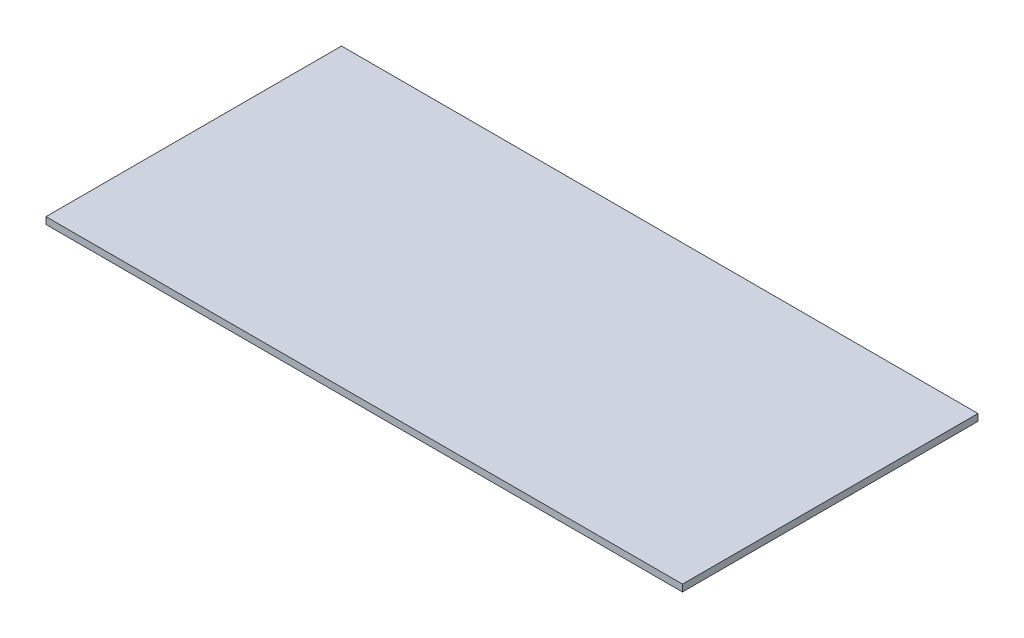
ISO-10303-21;
HEADER;
FILE_DESCRIPTION(('STEP AP214'),'2;1');
FILE_NAME('part.step','',(''),(''),'','','');
FILE_SCHEMA(('AUTOMOTIVE_DESIGN { 1 0 10303 214 1 1 1 1 }'));
ENDSEC;
DATA;
#1=APPLICATION_CONTEXT('core data for automotive mechanical design processes');
#2=APPLICATION_PROTOCOL_DEFINITION('international standard','automotive_design',2000,#1);
#3=PRODUCT_CONTEXT('',#1,'mechanical');
#4=PRODUCT('Part','Part','',(#3));
#5=PRODUCT_RELATED_PRODUCT_CATEGORY('part','',(#4));
#6=PRODUCT_DEFINITION_FORMATION('','',#4);
#7=PRODUCT_DEFINITION_CONTEXT('part definition',#1,'design');
#8=PRODUCT_DEFINITION('design','',#6,#7);
#9=PRODUCT_DEFINITION_SHAPE('','',#8);
#10=(LENGTH_UNIT() NAMED_UNIT(*) SI_UNIT(.MILLI.,.METRE.));
#11=(NAMED_UNIT(*) PLANE_ANGLE_UNIT() SI_UNIT($,.RADIAN.));
#12=(NAMED_UNIT(*) SI_UNIT($,.STERADIAN.) SOLID_ANGLE_UNIT());
#13=UNCERTAINTY_MEASURE_WITH_UNIT(LENGTH_MEASURE(1.E-05),#10,'distance_accuracy_value','');
#14=(GEOMETRIC_REPRESENTATION_CONTEXT(3) GLOBAL_UNCERTAINTY_ASSIGNED_CONTEXT((#13)) GLOBAL_UNIT_ASSIGNED_CONTEXT((#10,
#11,#12)) REPRESENTATION_CONTEXT('',''));
#15=CARTESIAN_POINT('',(0.,0.,0.));
#16=DIRECTION('',(0.,0.,1.));
#17=DIRECTION('',(1.,0.,0.));
#18=AXIS2_PLACEMENT_3D('',#15,#16,#17);
#19=CARTESIAN_POINT('',(0.,3.,-45.5890410958904));
#20=DIRECTION('',(-1.,0.,0.));
#21=DIRECTION('',(0.,0.,1.));
#22=AXIS2_PLACEMENT_3D('',#19,#20,#21);
#23=PLANE('',#22);
#24=DIRECTION('',(0.,0.,-1.));
#25=VECTOR('',#24,1.);
#26=CARTESIAN_POINT('',(0.,0.,-45.5890410958904));
#27=LINE('',#26,#25);
#28=CARTESIAN_POINT('',(0.,0.,84.4109589041096));
#29=VERTEX_POINT('',#28);
#30=CARTESIAN_POINT('',(0.,0.,-45.5890410958904));
#31=VERTEX_POINT('',#30);
#32=EDGE_CURVE('E114',#29,#31,#27,.T.);
#33=ORIENTED_EDGE('',*,*,#32,.T.);
#34=DIRECTION('',(0.,-1.,0.));
#35=VECTOR('',#34,1.);
#36=CARTESIAN_POINT('',(0.,3.,-45.5890410958904));
#37=LINE('',#36,#35);
#38=CARTESIAN_POINT('',(0.,3.,-45.5890410958904));
#39=VERTEX_POINT('',#38);
#40=EDGE_CURVE('E11',#39,#31,#37,.T.);
#41=ORIENTED_EDGE('',*,*,#40,.F.);
#42=DIRECTION('',(0.,0.,-1.));
#43=VECTOR('',#42,1.);
#44=CARTESIAN_POINT('',(0.,3.,-45.5890410958904));
#45=LINE('',#44,#43);
#46=CARTESIAN_POINT('',(0.,3.,84.4109589041096));
#47=VERTEX_POINT('',#46);
#48=EDGE_CURVE('E100',#47,#39,#45,.T.);
#49=ORIENTED_EDGE('',*,*,#48,.F.);
#50=DIRECTION('',(0.,-1.,0.));
#51=VECTOR('',#50,1.);
#52=CARTESIAN_POINT('',(0.,3.,84.4109589041096));
#53=LINE('',#52,#51);
#54=EDGE_CURVE('E108',#47,#29,#53,.T.);
#55=ORIENTED_EDGE('',*,*,#54,.T.);
#56=EDGE_LOOP('',(#33,#41,#49,#55));
#57=FACE_BOUND('',#56,.T.);
#58=ADVANCED_FACE('F44',(#57),#23,.F.);
#59=CARTESIAN_POINT('',(0.,3.,-45.5890410958904));
#60=DIRECTION('',(0.,0.,1.));
#61=DIRECTION('',(1.,0.,0.));
#62=AXIS2_PLACEMENT_3D('',#59,#60,#61);
#63=PLANE('',#62);
#64=DIRECTION('',(-1.,0.,0.));
#65=VECTOR('',#64,1.);
#66=CARTESIAN_POINT('',(0.,0.,-45.5890410958904));
#67=LINE('',#66,#65);
#68=CARTESIAN_POINT('',(-280.,0.,-45.5890410958904));
#69=VERTEX_POINT('',#68);
#70=EDGE_CURVE('E105',#31,#69,#67,.T.);
#71=ORIENTED_EDGE('',*,*,#70,.T.);
#72=DIRECTION('',(0.,-1.,0.));
#73=VECTOR('',#72,1.);
#74=CARTESIAN_POINT('',(-280.,3.,-45.5890410958904));
#75=LINE('',#74,#73);
#76=CARTESIAN_POINT('',(-280.,3.,-45.5890410958904));
#77=VERTEX_POINT('',#76);
#78=EDGE_CURVE('E53',#77,#69,#75,.T.);
#79=ORIENTED_EDGE('',*,*,#78,.F.);
#80=DIRECTION('',(-1.,0.,0.));
#81=VECTOR('',#80,1.);
#82=CARTESIAN_POINT('',(0.,3.,-45.5890410958904));
#83=LINE('',#82,#81);
#84=EDGE_CURVE('E95',#39,#77,#83,.T.);
#85=ORIENTED_EDGE('',*,*,#84,.F.);
#86=ORIENTED_EDGE('',*,*,#40,.T.);
#87=EDGE_LOOP('',(#71,#79,#85,#86));
#88=FACE_BOUND('',#87,.T.);
#89=ADVANCED_FACE('F101',(#88),#63,.F.);
#90=CARTESIAN_POINT('',(-280.,3.,-45.5890410958904));
#91=DIRECTION('',(1.,0.,0.));
#92=DIRECTION('',(0.,0.,-1.));
#93=AXIS2_PLACEMENT_3D('',#90,#91,#92);
#94=PLANE('',#93);
#95=DIRECTION('',(0.,0.,1.));
#96=VECTOR('',#95,1.);
#97=CARTESIAN_POINT('',(-280.,0.,-45.5890410958904));
#98=LINE('',#97,#96);
#99=CARTESIAN_POINT('',(-280.,0.,84.4109589041096));
#100=VERTEX_POINT('',#99);
#101=EDGE_CURVE('E78',#69,#100,#98,.T.);
#102=ORIENTED_EDGE('',*,*,#101,.T.);
#103=DIRECTION('',(0.,-1.,0.));
#104=VECTOR('',#103,1.);
#105=CARTESIAN_POINT('',(-280.,3.,84.4109589041096));
#106=LINE('',#105,#104);
#107=CARTESIAN_POINT('',(-280.,3.,84.4109589041096));
#108=VERTEX_POINT('',#107);
#109=EDGE_CURVE('E102',#108,#100,#106,.T.);
#110=ORIENTED_EDGE('',*,*,#109,.F.);
#111=DIRECTION('',(0.,0.,1.));
#112=VECTOR('',#111,1.);
#113=CARTESIAN_POINT('',(-280.,3.,-45.5890410958904));
#114=LINE('',#113,#112);
#115=EDGE_CURVE('E92',#77,#108,#114,.T.);
#116=ORIENTED_EDGE('',*,*,#115,.F.);
#117=ORIENTED_EDGE('',*,*,#78,.T.);
#118=EDGE_LOOP('',(#102,#110,#116,#117));
#119=FACE_BOUND('',#118,.T.);
#120=ADVANCED_FACE('F104',(#119),#94,.F.);
#121=CARTESIAN_POINT('',(0.,3.,84.4109589041096));
#122=DIRECTION('',(0.,0.,-1.));
#123=DIRECTION('',(-1.,0.,0.));
#124=AXIS2_PLACEMENT_3D('',#121,#122,#123);
#125=PLANE('',#124);
#126=DIRECTION('',(1.,0.,0.));
#127=VECTOR('',#126,1.);
#128=CARTESIAN_POINT('',(0.,0.,84.4109589041096));
#129=LINE('',#128,#127);
#130=EDGE_CURVE('E82',#100,#29,#129,.T.);
#131=ORIENTED_EDGE('',*,*,#130,.T.);
#132=ORIENTED_EDGE('',*,*,#54,.F.);
#133=DIRECTION('',(1.,0.,0.));
#134=VECTOR('',#133,1.);
#135=CARTESIAN_POINT('',(0.,3.,84.4109589041096));
#136=LINE('',#135,#134);
#137=EDGE_CURVE('E65',#108,#47,#136,.T.);
#138=ORIENTED_EDGE('',*,*,#137,.F.);
#139=ORIENTED_EDGE('',*,*,#109,.T.);
#140=EDGE_LOOP('',(#131,#132,#138,#139));
#141=FACE_BOUND('',#140,.T.);
#142=ADVANCED_FACE('F127',(#141),#125,.F.);
#143=CARTESIAN_POINT('',(0.,3.,0.));
#144=DIRECTION('',(0.,-1.,0.));
#145=DIRECTION('',(0.,0.,-1.));
#146=AXIS2_PLACEMENT_3D('',#143,#144,#145);
#147=PLANE('',#146);
#148=ORIENTED_EDGE('',*,*,#48,.T.);
#149=ORIENTED_EDGE('',*,*,#84,.T.);
#150=ORIENTED_EDGE('',*,*,#115,.T.);
#151=ORIENTED_EDGE('',*,*,#137,.T.);
#152=EDGE_LOOP('',(#148,#149,#150,#151));
#153=FACE_BOUND('',#152,.T.);
#154=ADVANCED_FACE('F91',(#153),#147,.F.);
#155=CARTESIAN_POINT('',(0.,0.,0.));
#156=DIRECTION('',(0.,-1.,0.));
#157=DIRECTION('',(0.,0.,-1.));
#158=AXIS2_PLACEMENT_3D('',#155,#156,#157);
#159=PLANE('',#158);
#160=ORIENTED_EDGE('',*,*,#32,.F.);
#161=ORIENTED_EDGE('',*,*,#130,.F.);
#162=ORIENTED_EDGE('',*,*,#101,.F.);
#163=ORIENTED_EDGE('',*,*,#70,.F.);
#164=EDGE_LOOP('',(#160,#161,#162,#163));
#165=FACE_BOUND('',#164,.T.);
#166=ADVANCED_FACE('F129',(#165),#159,.T.);
#167=CLOSED_SHELL('',(#58,#89,#120,#142,#154,#166));
#168=MANIFOLD_SOLID_BREP('B2',#167);
#169=ADVANCED_BREP_SHAPE_REPRESENTATION('',(#18,#168),#14);
#170=SHAPE_DEFINITION_REPRESENTATION(#9,#169);
ENDSEC;
END-ISO-10303-21;
